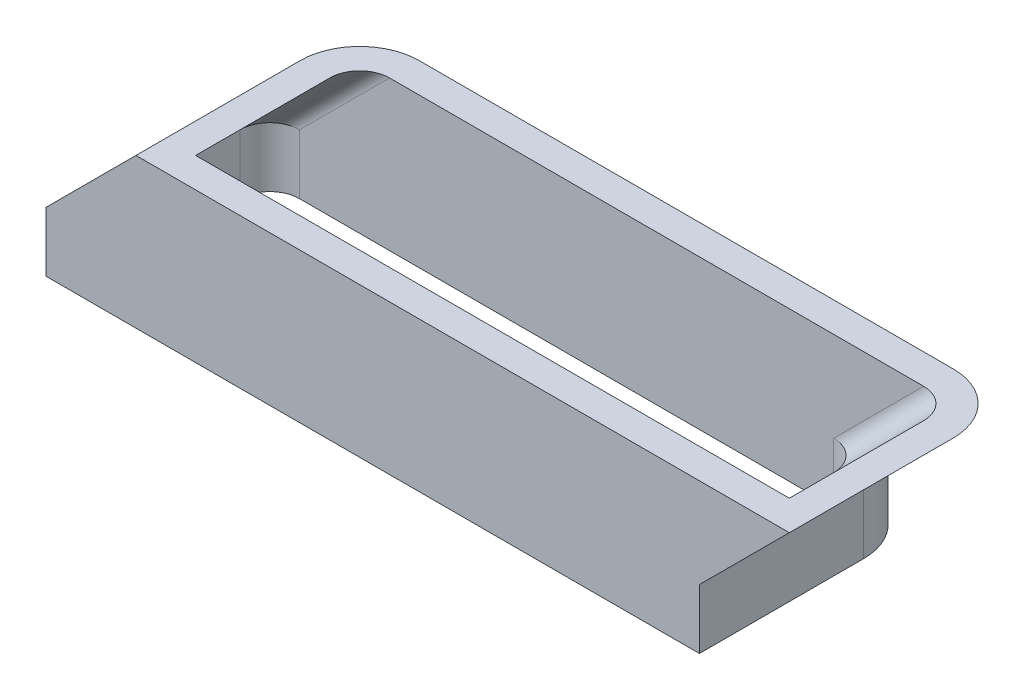
ISO-10303-21;
HEADER;
FILE_DESCRIPTION(('STEP AP214'),'2;1');
FILE_NAME('part.step','',(''),(''),'','','');
FILE_SCHEMA(('AUTOMOTIVE_DESIGN { 1 0 10303 214 1 1 1 1 }'));
ENDSEC;
DATA;
#1=APPLICATION_CONTEXT('core data for automotive mechanical design processes');
#2=APPLICATION_PROTOCOL_DEFINITION('international standard','automotive_design',2000,#1);
#3=PRODUCT_CONTEXT('',#1,'mechanical');
#4=PRODUCT('Part','Part','',(#3));
#5=PRODUCT_RELATED_PRODUCT_CATEGORY('part','',(#4));
#6=PRODUCT_DEFINITION_FORMATION('','',#4);
#7=PRODUCT_DEFINITION_CONTEXT('part definition',#1,'design');
#8=PRODUCT_DEFINITION('design','',#6,#7);
#9=PRODUCT_DEFINITION_SHAPE('','',#8);
#10=(LENGTH_UNIT() NAMED_UNIT(*) SI_UNIT(.MILLI.,.METRE.));
#11=(NAMED_UNIT(*) PLANE_ANGLE_UNIT() SI_UNIT($,.RADIAN.));
#12=(NAMED_UNIT(*) SI_UNIT($,.STERADIAN.) SOLID_ANGLE_UNIT());
#13=UNCERTAINTY_MEASURE_WITH_UNIT(LENGTH_MEASURE(1.E-05),#10,'distance_accuracy_value','');
#14=(GEOMETRIC_REPRESENTATION_CONTEXT(3) GLOBAL_UNCERTAINTY_ASSIGNED_CONTEXT((#13)) GLOBAL_UNIT_ASSIGNED_CONTEXT((#10,
#11,#12)) REPRESENTATION_CONTEXT('',''));
#15=CARTESIAN_POINT('',(0.,0.,0.));
#16=DIRECTION('',(0.,0.,1.));
#17=DIRECTION('',(1.,0.,0.));
#18=AXIS2_PLACEMENT_3D('',#15,#16,#17);
#19=CARTESIAN_POINT('',(-13.4207630136694,0.,5.29034482758621));
#20=DIRECTION('',(0.,0.,1.));
#21=DIRECTION('',(1.,0.,0.));
#22=AXIS2_PLACEMENT_3D('',#19,#20,#21);
#23=PLANE('',#22);
#24=DIRECTION('',(0.707106781186546,0.707106781186549,0.));
#25=VECTOR('',#24,1.);
#26=CARTESIAN_POINT('',(8.47923698633057,0.,5.29034482758621));
#27=LINE('',#26,#25);
#28=CARTESIAN_POINT('',(8.47923698633058,0.,5.29034482758621));
#29=VERTEX_POINT('',#28);
#30=CARTESIAN_POINT('',(11.4929724598586,3.01373547352806,5.29034482758621));
#31=VERTEX_POINT('',#30);
#32=EDGE_CURVE('E183',#29,#31,#27,.T.);
#33=ORIENTED_EDGE('',*,*,#32,.T.);
#34=DIRECTION('',(1.,0.,0.));
#35=VECTOR('',#34,1.);
#36=CARTESIAN_POINT('',(-10.4070275401414,3.01373547352806,5.29034482758621));
#37=LINE('',#36,#35);
#38=CARTESIAN_POINT('',(-10.4070275401414,3.01373547352806,5.29034482758621));
#39=VERTEX_POINT('',#38);
#40=EDGE_CURVE('E155',#39,#31,#37,.T.);
#41=ORIENTED_EDGE('',*,*,#40,.F.);
#42=DIRECTION('',(0.707106781186546,0.707106781186549,0.));
#43=VECTOR('',#42,1.);
#44=CARTESIAN_POINT('',(-13.4207630136694,0.,5.29034482758621));
#45=LINE('',#44,#43);
#46=CARTESIAN_POINT('',(-13.4207630136694,0.,5.29034482758621));
#47=VERTEX_POINT('',#46);
#48=EDGE_CURVE('E187',#47,#39,#45,.T.);
#49=ORIENTED_EDGE('',*,*,#48,.F.);
#50=DIRECTION('',(0.,1.,0.));
#51=VECTOR('',#50,1.);
#52=CARTESIAN_POINT('',(-13.4207630136694,-2.,5.2903448275862));
#53=LINE('',#52,#51);
#54=CARTESIAN_POINT('',(-13.4207630136694,-2.,5.2903448275862));
#55=VERTEX_POINT('',#54);
#56=EDGE_CURVE('E242',#55,#47,#53,.T.);
#57=ORIENTED_EDGE('',*,*,#56,.F.);
#58=DIRECTION('',(-1.,0.,0.));
#59=VECTOR('',#58,1.);
#60=CARTESIAN_POINT('',(8.47923698633058,-2.,5.29034482758621));
#61=LINE('',#60,#59);
#62=CARTESIAN_POINT('',(8.47923698633058,-2.,5.29034482758621));
#63=VERTEX_POINT('',#62);
#64=EDGE_CURVE('E241',#63,#55,#61,.T.);
#65=ORIENTED_EDGE('',*,*,#64,.F.);
#66=DIRECTION('',(0.,1.,0.));
#67=VECTOR('',#66,1.);
#68=CARTESIAN_POINT('',(8.47923698633058,-2.,5.29034482758621));
#69=LINE('',#68,#67);
#70=EDGE_CURVE('E235',#63,#29,#69,.T.);
#71=ORIENTED_EDGE('',*,*,#70,.T.);
#72=EDGE_LOOP('',(#33,#41,#49,#57,#65,#71));
#73=FACE_BOUND('',#72,.T.);
#74=ADVANCED_FACE('F45',(#73),#23,.T.);
#75=CARTESIAN_POINT('',(8.47923698633058,0.,-0.209655172413795));
#76=DIRECTION('',(0.707106781186549,-0.707106781186546,0.));
#77=DIRECTION('',(0.707106781186546,0.707106781186549,0.));
#78=AXIS2_PLACEMENT_3D('',#75,#76,#77);
#79=PLANE('',#78);
#80=DIRECTION('',(0.707106781186546,0.707106781186549,0.));
#81=VECTOR('',#80,1.);
#82=CARTESIAN_POINT('',(8.47923698633057,0.,-0.209655172413795));
#83=LINE('',#82,#81);
#84=CARTESIAN_POINT('',(8.47923698633058,0.,-0.209655172413795));
#85=VERTEX_POINT('',#84);
#86=CARTESIAN_POINT('',(11.4929724598586,3.01373547352806,-0.209655172413795));
#87=VERTEX_POINT('',#86);
#88=EDGE_CURVE('E186',#85,#87,#83,.T.);
#89=ORIENTED_EDGE('',*,*,#88,.T.);
#90=DIRECTION('',(0.,0.,-1.));
#91=VECTOR('',#90,1.);
#92=CARTESIAN_POINT('',(11.4929724598586,3.01373547352806,-0.209655172413795));
#93=LINE('',#92,#91);
#94=EDGE_CURVE('E158',#31,#87,#93,.T.);
#95=ORIENTED_EDGE('',*,*,#94,.F.);
#96=ORIENTED_EDGE('',*,*,#32,.F.);
#97=DIRECTION('',(0.,0.,-1.));
#98=VECTOR('',#97,1.);
#99=CARTESIAN_POINT('',(8.47923698633058,0.,-0.209655172413795));
#100=LINE('',#99,#98);
#101=EDGE_CURVE('E175',#29,#85,#100,.T.);
#102=ORIENTED_EDGE('',*,*,#101,.T.);
#103=EDGE_LOOP('',(#89,#95,#96,#102));
#104=FACE_BOUND('',#103,.T.);
#105=ADVANCED_FACE('F228',(#104),#79,.T.);
#106=CARTESIAN_POINT('',(8.47923698633057,0.,-0.209655172413794));
#107=CARTESIAN_POINT('',(11.4929724598586,3.01373547352806,-0.209655172413794));
#108=CARTESIAN_POINT('',(8.47923698633057,0.,-1.38122804766761));
#109=CARTESIAN_POINT('',(11.4929724598586,3.01373547352806,-1.38122804766761));
#110=CARTESIAN_POINT('',(7.65080986158438,0.,-2.2096551724138));
#111=CARTESIAN_POINT('',(10.6645453351124,3.01373547352806,-2.2096551724138));
#112=CARTESIAN_POINT('',(6.47923698633057,0.,-2.2096551724138));
#113=CARTESIAN_POINT('',(9.49297245985863,3.01373547352806,-2.2096551724138));
#114=(BOUNDED_SURFACE() B_SPLINE_SURFACE(3,1,((#106,#107),(#108,#109),(#110,#111),(#112,#113)),
.UNSPECIFIED.,.F.,.F.,.F.) B_SPLINE_SURFACE_WITH_KNOTS((4,4),(2,2),(0.,1.),(0.,1.),
.UNSPECIFIED.) GEOMETRIC_REPRESENTATION_ITEM() RATIONAL_B_SPLINE_SURFACE(((1.,1.),
(0.804737854124365,0.804737854124365),(0.804737854124365,0.804737854124365),(1.,1.))) REPRESENTATION_ITEM('') SURFACE());
#115=DIRECTION('',(0.707106781186546,0.707106781186549,0.));
#116=VECTOR('',#115,1.);
#117=CARTESIAN_POINT('',(6.47923698633057,0.,-2.20965517241379));
#118=LINE('',#117,#116);
#119=CARTESIAN_POINT('',(6.47923698633057,0.,-2.20965517241379));
#120=VERTEX_POINT('',#119);
#121=CARTESIAN_POINT('',(9.49297245985863,3.01373547352806,-2.20965517241379));
#122=VERTEX_POINT('',#121);
#123=EDGE_CURVE('E192',#120,#122,#118,.T.);
#124=CARTESIAN_POINT('',(9.49297245985863,3.01373547352806,-0.209655172413795));
#125=DIRECTION('',(0.,1.,0.));
#126=DIRECTION('',(0.,0.,-1.));
#127=AXIS2_PLACEMENT_3D('',#124,#125,#126);
#128=CIRCLE('',#127,2.);
#129=EDGE_CURVE('E167',#87,#122,#128,.T.);
#130=CARTESIAN_POINT('',(6.47923698633057,0.,-0.209655172413795));
#131=DIRECTION('',(0.,1.,0.));
#132=DIRECTION('',(0.,0.,-1.));
#133=AXIS2_PLACEMENT_3D('',#130,#131,#132);
#134=CIRCLE('',#133,2.);
#135=EDGE_CURVE('E163',#85,#120,#134,.T.);
#136=ORIENTED_EDGE('',*,*,#123,.T.);
#137=ORIENTED_EDGE('',*,*,#129,.F.);
#138=ORIENTED_EDGE('',*,*,#88,.F.);
#139=ORIENTED_EDGE('',*,*,#135,.T.);
#140=EDGE_LOOP('',(#136,#137,#138,#139));
#141=FACE_BOUND('',#140,.T.);
#142=ADVANCED_FACE('F208',(#141),#114,.T.);
#143=CARTESIAN_POINT('',(-11.4207630136694,0.,-2.20965517241379));
#144=DIRECTION('',(0.,0.,-1.));
#145=DIRECTION('',(-1.,0.,0.));
#146=AXIS2_PLACEMENT_3D('',#143,#144,#145);
#147=PLANE('',#146);
#148=DIRECTION('',(0.707106781186546,0.707106781186549,0.));
#149=VECTOR('',#148,1.);
#150=CARTESIAN_POINT('',(-11.4207630136694,0.,-2.20965517241379));
#151=LINE('',#150,#149);
#152=CARTESIAN_POINT('',(-11.4207630136694,0.,-2.20965517241379));
#153=VERTEX_POINT('',#152);
#154=CARTESIAN_POINT('',(-8.40702754014137,3.01373547352806,-2.20965517241379));
#155=VERTEX_POINT('',#154);
#156=EDGE_CURVE('E194',#153,#155,#151,.T.);
#157=ORIENTED_EDGE('',*,*,#156,.T.);
#158=DIRECTION('',(-1.,0.,0.));
#159=VECTOR('',#158,1.);
#160=CARTESIAN_POINT('',(-8.40702754014137,3.01373547352806,-2.20965517241379));
#161=LINE('',#160,#159);
#162=EDGE_CURVE('E164',#122,#155,#161,.T.);
#163=ORIENTED_EDGE('',*,*,#162,.F.);
#164=ORIENTED_EDGE('',*,*,#123,.F.);
#165=DIRECTION('',(0.,1.,0.));
#166=VECTOR('',#165,1.);
#167=CARTESIAN_POINT('',(6.47923698633057,-2.,-2.20965517241379));
#168=LINE('',#167,#166);
#169=CARTESIAN_POINT('',(6.47923698633057,-2.,-2.20965517241379));
#170=VERTEX_POINT('',#169);
#171=EDGE_CURVE('E221',#170,#120,#168,.T.);
#172=ORIENTED_EDGE('',*,*,#171,.F.);
#173=DIRECTION('',(1.,0.,0.));
#174=VECTOR('',#173,1.);
#175=CARTESIAN_POINT('',(-11.4207630136694,-2.,-2.20965517241379));
#176=LINE('',#175,#174);
#177=CARTESIAN_POINT('',(-11.4207630136694,-2.,-2.20965517241379));
#178=VERTEX_POINT('',#177);
#179=EDGE_CURVE('E556',#178,#170,#176,.T.);
#180=ORIENTED_EDGE('',*,*,#179,.F.);
#181=DIRECTION('',(0.,1.,0.));
#182=VECTOR('',#181,1.);
#183=CARTESIAN_POINT('',(-11.4207630136694,-2.,-2.20965517241379));
#184=LINE('',#183,#182);
#185=EDGE_CURVE('E559',#178,#153,#184,.T.);
#186=ORIENTED_EDGE('',*,*,#185,.T.);
#187=EDGE_LOOP('',(#157,#163,#164,#172,#180,#186));
#188=FACE_BOUND('',#187,.T.);
#189=ADVANCED_FACE('F204',(#188),#147,.T.);
#190=CARTESIAN_POINT('',(-11.4207630136694,0.,-2.20965517241379));
#191=CARTESIAN_POINT('',(-8.40702754014137,3.01373547352806,-2.20965517241379));
#192=CARTESIAN_POINT('',(-12.5923358889232,0.,-2.20965517241379));
#193=CARTESIAN_POINT('',(-9.57860041539518,3.01373547352806,-2.20965517241379));
#194=CARTESIAN_POINT('',(-13.4207630136694,0.,-1.3812280476676));
#195=CARTESIAN_POINT('',(-10.4070275401414,3.01373547352806,-1.3812280476676));
#196=CARTESIAN_POINT('',(-13.4207630136694,0.,-0.209655172413784));
#197=CARTESIAN_POINT('',(-10.4070275401414,3.01373547352806,-0.209655172413784));
#198=(BOUNDED_SURFACE() B_SPLINE_SURFACE(3,1,((#190,#191),(#192,#193),(#194,#195),(#196,#197)),
.UNSPECIFIED.,.F.,.F.,.F.) B_SPLINE_SURFACE_WITH_KNOTS((4,4),(2,2),(0.,1.),(0.,1.),
.UNSPECIFIED.) GEOMETRIC_REPRESENTATION_ITEM() RATIONAL_B_SPLINE_SURFACE(((1.,1.),
(0.804737854124364,0.804737854124364),(0.804737854124364,0.804737854124364),(1.,1.))) REPRESENTATION_ITEM('') SURFACE());
#199=DIRECTION('',(0.707106781186546,0.707106781186549,0.));
#200=VECTOR('',#199,1.);
#201=CARTESIAN_POINT('',(-13.4207630136694,0.,-0.209655172413784));
#202=LINE('',#201,#200);
#203=CARTESIAN_POINT('',(-13.4207630136694,0.,-0.209655172413784));
#204=VERTEX_POINT('',#203);
#205=CARTESIAN_POINT('',(-10.4070275401414,3.01373547352806,-0.209655172413784));
#206=VERTEX_POINT('',#205);
#207=EDGE_CURVE('E49',#204,#206,#202,.T.);
#208=CARTESIAN_POINT('',(-8.40702754014137,3.01373547352806,-0.209655172413795));
#209=DIRECTION('',(0.,1.,0.));
#210=DIRECTION('',(0.,0.,1.));
#211=AXIS2_PLACEMENT_3D('',#208,#209,#210);
#212=CIRCLE('',#211,2.);
#213=EDGE_CURVE('E160',#155,#206,#212,.T.);
#214=CARTESIAN_POINT('',(-11.4207630136694,0.,-0.209655172413795));
#215=DIRECTION('',(0.,1.,0.));
#216=DIRECTION('',(0.,0.,1.));
#217=AXIS2_PLACEMENT_3D('',#214,#215,#216);
#218=CIRCLE('',#217,2.);
#219=EDGE_CURVE('E176',#153,#204,#218,.T.);
#220=ORIENTED_EDGE('',*,*,#207,.T.);
#221=ORIENTED_EDGE('',*,*,#213,.F.);
#222=ORIENTED_EDGE('',*,*,#156,.F.);
#223=ORIENTED_EDGE('',*,*,#219,.T.);
#224=EDGE_LOOP('',(#220,#221,#222,#223));
#225=FACE_BOUND('',#224,.T.);
#226=ADVANCED_FACE('F200',(#225),#198,.T.);
#227=CARTESIAN_POINT('',(-13.4207630136694,0.,-0.209655172413784));
#228=DIRECTION('',(-0.707106781186549,0.707106781186546,0.));
#229=DIRECTION('',(-0.707106781186546,-0.707106781186549,0.));
#230=AXIS2_PLACEMENT_3D('',#227,#228,#229);
#231=PLANE('',#230);
#232=DIRECTION('',(0.,0.,1.));
#233=VECTOR('',#232,1.);
#234=CARTESIAN_POINT('',(-10.4070275401414,3.01373547352806,-0.209655172413784));
#235=LINE('',#234,#233);
#236=EDGE_CURVE('E90',#206,#39,#235,.T.);
#237=ORIENTED_EDGE('',*,*,#236,.F.);
#238=ORIENTED_EDGE('',*,*,#207,.F.);
#239=DIRECTION('',(0.,0.,1.));
#240=VECTOR('',#239,1.);
#241=CARTESIAN_POINT('',(-13.4207630136694,0.,-0.209655172413784));
#242=LINE('',#241,#240);
#243=EDGE_CURVE('E172',#204,#47,#242,.T.);
#244=ORIENTED_EDGE('',*,*,#243,.T.);
#245=ORIENTED_EDGE('',*,*,#48,.T.);
#246=EDGE_LOOP('',(#237,#238,#244,#245));
#247=FACE_BOUND('',#246,.T.);
#248=ADVANCED_FACE('F47',(#247),#231,.T.);
#249=CARTESIAN_POINT('',(-8.40702754014137,3.01373547352806,-0.209655172413795));
#250=DIRECTION('',(0.,1.,0.));
#251=DIRECTION('',(0.,0.,1.));
#252=AXIS2_PLACEMENT_3D('',#249,#250,#251);
#253=PLANE('',#252);
#254=DIRECTION('',(0.,0.,-1.));
#255=VECTOR('',#254,1.);
#256=CARTESIAN_POINT('',(10.4929724598586,3.01373547352806,-0.209655172413795));
#257=LINE('',#256,#255);
#258=CARTESIAN_POINT('',(10.4929724598586,3.01373547352806,-0.209655172413795));
#259=VERTEX_POINT('',#258);
#260=CARTESIAN_POINT('',(10.4929724598586,3.01373547352806,4.29034482758621));
#261=VERTEX_POINT('',#260);
#262=EDGE_CURVE('E11',#259,#261,#257,.F.);
#263=ORIENTED_EDGE('',*,*,#262,.T.);
#264=DIRECTION('',(1.,0.,0.));
#265=VECTOR('',#264,1.);
#266=CARTESIAN_POINT('',(-9.40702754014137,3.01373547352806,4.29034482758621));
#267=LINE('',#266,#265);
#268=CARTESIAN_POINT('',(-9.40702754014137,3.01373547352806,4.29034482758621));
#269=VERTEX_POINT('',#268);
#270=EDGE_CURVE('E250',#261,#269,#267,.F.);
#271=ORIENTED_EDGE('',*,*,#270,.T.);
#272=DIRECTION('',(0.,0.,1.));
#273=VECTOR('',#272,1.);
#274=CARTESIAN_POINT('',(-9.40702754014137,3.01373547352806,-0.209655172413784));
#275=LINE('',#274,#273);
#276=CARTESIAN_POINT('',(-9.40702754014137,3.01373547352806,-0.209655172413784));
#277=VERTEX_POINT('',#276);
#278=EDGE_CURVE('E119',#269,#277,#275,.F.);
#279=ORIENTED_EDGE('',*,*,#278,.T.);
#280=CARTESIAN_POINT('',(-8.40702754014137,3.01373547352806,-0.209655172413795));
#281=DIRECTION('',(0.,1.,0.));
#282=DIRECTION('',(0.,0.,1.));
#283=AXIS2_PLACEMENT_3D('',#280,#281,#282);
#284=CIRCLE('',#283,1.);
#285=CARTESIAN_POINT('',(-8.40702754014137,3.01373547352806,-1.20965517241379));
#286=VERTEX_POINT('',#285);
#287=EDGE_CURVE('E113',#277,#286,#284,.F.);
#288=ORIENTED_EDGE('',*,*,#287,.T.);
#289=DIRECTION('',(-1.,0.,0.));
#290=VECTOR('',#289,1.);
#291=CARTESIAN_POINT('',(-8.40702754014137,3.01373547352806,-1.20965517241379));
#292=LINE('',#291,#290);
#293=CARTESIAN_POINT('',(9.49297245985863,3.01373547352806,-1.20965517241379));
#294=VERTEX_POINT('',#293);
#295=EDGE_CURVE('E117',#286,#294,#292,.F.);
#296=ORIENTED_EDGE('',*,*,#295,.T.);
#297=CARTESIAN_POINT('',(9.49297245985863,3.01373547352806,-0.209655172413795));
#298=DIRECTION('',(0.,1.,0.));
#299=DIRECTION('',(0.,0.,-1.));
#300=AXIS2_PLACEMENT_3D('',#297,#298,#299);
#301=CIRCLE('',#300,1.);
#302=EDGE_CURVE('E63',#294,#259,#301,.F.);
#303=ORIENTED_EDGE('',*,*,#302,.T.);
#304=EDGE_LOOP('',(#263,#271,#279,#288,#296,#303));
#305=FACE_BOUND('',#304,.T.);
#306=ORIENTED_EDGE('',*,*,#213,.T.);
#307=ORIENTED_EDGE('',*,*,#236,.T.);
#308=ORIENTED_EDGE('',*,*,#40,.T.);
#309=ORIENTED_EDGE('',*,*,#94,.T.);
#310=ORIENTED_EDGE('',*,*,#129,.T.);
#311=ORIENTED_EDGE('',*,*,#162,.T.);
#312=EDGE_LOOP('',(#306,#307,#308,#309,#310,#311));
#313=FACE_BOUND('',#312,.T.);
#314=ADVANCED_FACE('F115',(#305,#313),#253,.T.);
#315=CARTESIAN_POINT('',(-12.4207630136694,0.,4.29034482758621));
#316=DIRECTION('',(0.,0.,-1.));
#317=DIRECTION('',(-1.,0.,0.));
#318=AXIS2_PLACEMENT_3D('',#315,#316,#317);
#319=PLANE('',#318);
#320=DIRECTION('',(0.707106781186546,0.707106781186549,0.));
#321=VECTOR('',#320,1.);
#322=CARTESIAN_POINT('',(-12.4207630136694,0.,4.29034482758621));
#323=LINE('',#322,#321);
#324=CARTESIAN_POINT('',(-12.4207630136694,0.,4.29034482758621));
#325=VERTEX_POINT('',#324);
#326=EDGE_CURVE('E252',#325,#269,#323,.T.);
#327=ORIENTED_EDGE('',*,*,#326,.T.);
#328=ORIENTED_EDGE('',*,*,#270,.F.);
#329=DIRECTION('',(0.707106781186546,0.707106781186549,0.));
#330=VECTOR('',#329,1.);
#331=CARTESIAN_POINT('',(7.47923698633057,0.,4.29034482758621));
#332=LINE('',#331,#330);
#333=CARTESIAN_POINT('',(7.47923698633057,0.,4.29034482758621));
#334=VERTEX_POINT('',#333);
#335=EDGE_CURVE('E153',#334,#261,#332,.T.);
#336=ORIENTED_EDGE('',*,*,#335,.F.);
#337=DIRECTION('',(0.,1.,0.));
#338=VECTOR('',#337,1.);
#339=CARTESIAN_POINT('',(7.47923698633057,-2.,4.29034482758621));
#340=LINE('',#339,#338);
#341=CARTESIAN_POINT('',(7.47923698633057,-2.,4.29034482758621));
#342=VERTEX_POINT('',#341);
#343=EDGE_CURVE('E543',#342,#334,#340,.T.);
#344=ORIENTED_EDGE('',*,*,#343,.F.);
#345=DIRECTION('',(-1.,0.,0.));
#346=VECTOR('',#345,1.);
#347=CARTESIAN_POINT('',(7.47923698633057,-2.,4.29034482758621));
#348=LINE('',#347,#346);
#349=CARTESIAN_POINT('',(-12.4207630136694,-2.,4.29034482758621));
#350=VERTEX_POINT('',#349);
#351=EDGE_CURVE('E574',#342,#350,#348,.T.);
#352=ORIENTED_EDGE('',*,*,#351,.T.);
#353=DIRECTION('',(0.,1.,0.));
#354=VECTOR('',#353,1.);
#355=CARTESIAN_POINT('',(-12.4207630136694,-2.,4.29034482758621));
#356=LINE('',#355,#354);
#357=EDGE_CURVE('E536',#350,#325,#356,.T.);
#358=ORIENTED_EDGE('',*,*,#357,.T.);
#359=EDGE_LOOP('',(#327,#328,#336,#344,#352,#358));
#360=FACE_BOUND('',#359,.T.);
#361=ADVANCED_FACE('F313',(#360),#319,.T.);
#362=CARTESIAN_POINT('',(-12.4207630136694,0.,-0.209655172413784));
#363=DIRECTION('',(0.707106781186549,-0.707106781186546,0.));
#364=DIRECTION('',(0.707106781186546,0.707106781186549,0.));
#365=AXIS2_PLACEMENT_3D('',#362,#363,#364);
#366=PLANE('',#365);
#367=DIRECTION('',(0.707106781186546,0.707106781186549,0.));
#368=VECTOR('',#367,1.);
#369=CARTESIAN_POINT('',(-12.4207630136694,0.,-0.209655172413784));
#370=LINE('',#369,#368);
#371=CARTESIAN_POINT('',(-12.4207630136694,0.,-0.209655172413784));
#372=VERTEX_POINT('',#371);
#373=EDGE_CURVE('E125',#372,#277,#370,.T.);
#374=ORIENTED_EDGE('',*,*,#373,.T.);
#375=ORIENTED_EDGE('',*,*,#278,.F.);
#376=ORIENTED_EDGE('',*,*,#326,.F.);
#377=DIRECTION('',(0.,0.,1.));
#378=VECTOR('',#377,1.);
#379=CARTESIAN_POINT('',(-12.4207630136694,0.,-0.209655172413784));
#380=LINE('',#379,#378);
#381=EDGE_CURVE('E99',#325,#372,#380,.F.);
#382=ORIENTED_EDGE('',*,*,#381,.T.);
#383=EDGE_LOOP('',(#374,#375,#376,#382));
#384=FACE_BOUND('',#383,.T.);
#385=ADVANCED_FACE('F260',(#384),#366,.T.);
#386=CARTESIAN_POINT('',(-12.4207630136694,0.,-0.209655172413784));
#387=CARTESIAN_POINT('',(-9.40702754014137,3.01373547352806,-0.209655172413784));
#388=CARTESIAN_POINT('',(-12.4207630136694,0.,-0.795441610040694));
#389=CARTESIAN_POINT('',(-9.40702754014138,3.01373547352806,-0.795441610040694));
#390=CARTESIAN_POINT('',(-12.0065494512963,0.,-1.20965517241379));
#391=CARTESIAN_POINT('',(-8.99281397776828,3.01373547352806,-1.20965517241379));
#392=CARTESIAN_POINT('',(-11.4207630136694,0.,-1.20965517241379));
#393=CARTESIAN_POINT('',(-8.40702754014137,3.01373547352806,-1.20965517241379));
#394=(BOUNDED_SURFACE() B_SPLINE_SURFACE(3,1,((#386,#387),(#388,#389),(#390,#391),(#392,#393)),
.UNSPECIFIED.,.F.,.F.,.F.) B_SPLINE_SURFACE_WITH_KNOTS((4,4),(2,2),(0.,1.),(0.,1.),
.UNSPECIFIED.) GEOMETRIC_REPRESENTATION_ITEM() RATIONAL_B_SPLINE_SURFACE(((1.,1.),
(0.804737854124363,0.804737854124363),(0.804737854124363,0.804737854124363),(1.,1.))) REPRESENTATION_ITEM('') SURFACE());
#395=DIRECTION('',(0.707106781186546,0.707106781186549,0.));
#396=VECTOR('',#395,1.);
#397=CARTESIAN_POINT('',(-11.4207630136694,0.,-1.20965517241379));
#398=LINE('',#397,#396);
#399=CARTESIAN_POINT('',(-11.4207630136694,0.,-1.20965517241379));
#400=VERTEX_POINT('',#399);
#401=EDGE_CURVE('E124',#400,#286,#398,.T.);
#402=CARTESIAN_POINT('',(-11.4207630136694,0.,-0.209655172413795));
#403=DIRECTION('',(0.,1.,0.));
#404=DIRECTION('',(0.,0.,1.));
#405=AXIS2_PLACEMENT_3D('',#402,#403,#404);
#406=CIRCLE('',#405,1.);
#407=EDGE_CURVE('E140',#372,#400,#406,.F.);
#408=ORIENTED_EDGE('',*,*,#401,.T.);
#409=ORIENTED_EDGE('',*,*,#287,.F.);
#410=ORIENTED_EDGE('',*,*,#373,.F.);
#411=ORIENTED_EDGE('',*,*,#407,.T.);
#412=EDGE_LOOP('',(#408,#409,#410,#411));
#413=FACE_BOUND('',#412,.T.);
#414=ADVANCED_FACE('F138',(#413),#394,.T.);
#415=CARTESIAN_POINT('',(-11.4207630136694,0.,-1.20965517241379));
#416=DIRECTION('',(0.,0.,1.));
#417=DIRECTION('',(1.,0.,0.));
#418=AXIS2_PLACEMENT_3D('',#415,#416,#417);
#419=PLANE('',#418);
#420=DIRECTION('',(0.707106781186546,0.707106781186549,0.));
#421=VECTOR('',#420,1.);
#422=CARTESIAN_POINT('',(6.47923698633057,0.,-1.20965517241379));
#423=LINE('',#422,#421);
#424=CARTESIAN_POINT('',(6.47923698633057,0.,-1.20965517241379));
#425=VERTEX_POINT('',#424);
#426=EDGE_CURVE('E135',#425,#294,#423,.T.);
#427=ORIENTED_EDGE('',*,*,#426,.T.);
#428=ORIENTED_EDGE('',*,*,#295,.F.);
#429=ORIENTED_EDGE('',*,*,#401,.F.);
#430=DIRECTION('',(0.,1.,0.));
#431=VECTOR('',#430,1.);
#432=CARTESIAN_POINT('',(-11.4207630136694,-2.,-1.20965517241379));
#433=LINE('',#432,#431);
#434=CARTESIAN_POINT('',(-11.4207630136694,-2.,-1.20965517241379));
#435=VERTEX_POINT('',#434);
#436=EDGE_CURVE('E298',#435,#400,#433,.T.);
#437=ORIENTED_EDGE('',*,*,#436,.F.);
#438=DIRECTION('',(1.,0.,0.));
#439=VECTOR('',#438,1.);
#440=CARTESIAN_POINT('',(-11.4207630136694,-2.,-1.20965517241379));
#441=LINE('',#440,#439);
#442=CARTESIAN_POINT('',(6.47923698633057,-2.,-1.20965517241379));
#443=VERTEX_POINT('',#442);
#444=EDGE_CURVE('E538',#435,#443,#441,.T.);
#445=ORIENTED_EDGE('',*,*,#444,.T.);
#446=DIRECTION('',(0.,1.,0.));
#447=VECTOR('',#446,1.);
#448=CARTESIAN_POINT('',(6.47923698633057,-2.,-1.20965517241379));
#449=LINE('',#448,#447);
#450=EDGE_CURVE('E534',#443,#425,#449,.T.);
#451=ORIENTED_EDGE('',*,*,#450,.T.);
#452=EDGE_LOOP('',(#427,#428,#429,#437,#445,#451));
#453=FACE_BOUND('',#452,.T.);
#454=ADVANCED_FACE('F130',(#453),#419,.T.);
#455=CARTESIAN_POINT('',(6.47923698633057,0.,-1.2096551724138));
#456=CARTESIAN_POINT('',(9.49297245985863,3.01373547352806,-1.2096551724138));
#457=CARTESIAN_POINT('',(7.06502342395748,0.,-1.2096551724138));
#458=CARTESIAN_POINT('',(10.0787588974855,3.01373547352806,-1.2096551724138));
#459=CARTESIAN_POINT('',(7.47923698633057,0.,-0.795441610040701));
#460=CARTESIAN_POINT('',(10.4929724598586,3.01373547352806,-0.795441610040701));
#461=CARTESIAN_POINT('',(7.47923698633057,0.,-0.209655172413794));
#462=CARTESIAN_POINT('',(10.4929724598586,3.01373547352806,-0.209655172413794));
#463=(BOUNDED_SURFACE() B_SPLINE_SURFACE(3,1,((#455,#456),(#457,#458),(#459,#460),(#461,#462)),
.UNSPECIFIED.,.F.,.F.,.F.) B_SPLINE_SURFACE_WITH_KNOTS((4,4),(2,2),(0.,1.),(0.,1.),
.UNSPECIFIED.) GEOMETRIC_REPRESENTATION_ITEM() RATIONAL_B_SPLINE_SURFACE(((1.,1.),
(0.804737854124365,0.804737854124365),(0.804737854124365,0.804737854124365),(1.,1.))) REPRESENTATION_ITEM('') SURFACE());
#464=DIRECTION('',(0.707106781186546,0.707106781186549,0.));
#465=VECTOR('',#464,1.);
#466=CARTESIAN_POINT('',(7.47923698633057,0.,-0.209655172413795));
#467=LINE('',#466,#465);
#468=CARTESIAN_POINT('',(7.47923698633058,0.,-0.209655172413795));
#469=VERTEX_POINT('',#468);
#470=EDGE_CURVE('E55',#469,#259,#467,.T.);
#471=CARTESIAN_POINT('',(6.47923698633057,0.,-0.209655172413795));
#472=DIRECTION('',(0.,1.,0.));
#473=DIRECTION('',(0.,0.,-1.));
#474=AXIS2_PLACEMENT_3D('',#471,#472,#473);
#475=CIRCLE('',#474,1.);
#476=EDGE_CURVE('E145',#425,#469,#475,.F.);
#477=ORIENTED_EDGE('',*,*,#470,.T.);
#478=ORIENTED_EDGE('',*,*,#302,.F.);
#479=ORIENTED_EDGE('',*,*,#426,.F.);
#480=ORIENTED_EDGE('',*,*,#476,.T.);
#481=EDGE_LOOP('',(#477,#478,#479,#480));
#482=FACE_BOUND('',#481,.T.);
#483=ADVANCED_FACE('F318',(#482),#463,.T.);
#484=CARTESIAN_POINT('',(7.47923698633058,0.,-0.209655172413795));
#485=DIRECTION('',(-0.707106781186549,0.707106781186546,0.));
#486=DIRECTION('',(-0.707106781186546,-0.707106781186549,0.));
#487=AXIS2_PLACEMENT_3D('',#484,#485,#486);
#488=PLANE('',#487);
#489=ORIENTED_EDGE('',*,*,#262,.F.);
#490=ORIENTED_EDGE('',*,*,#470,.F.);
#491=DIRECTION('',(0.,0.,-1.));
#492=VECTOR('',#491,1.);
#493=CARTESIAN_POINT('',(7.47923698633058,0.,-0.209655172413795));
#494=LINE('',#493,#492);
#495=EDGE_CURVE('E148',#469,#334,#494,.F.);
#496=ORIENTED_EDGE('',*,*,#495,.T.);
#497=ORIENTED_EDGE('',*,*,#335,.T.);
#498=EDGE_LOOP('',(#489,#490,#496,#497));
#499=FACE_BOUND('',#498,.T.);
#500=ADVANCED_FACE('F315',(#499),#488,.T.);
#501=CARTESIAN_POINT('',(6.47923698633057,-2.,-0.209655172413795));
#502=DIRECTION('',(0.,-1.,0.));
#503=DIRECTION('',(0.,0.,-1.));
#504=AXIS2_PLACEMENT_3D('',#501,#502,#503);
#505=PLANE('',#504);
#506=CARTESIAN_POINT('',(6.47923698633057,-2.,-0.209655172413795));
#507=DIRECTION('',(0.,-1.,0.));
#508=DIRECTION('',(0.,0.,-1.));
#509=AXIS2_PLACEMENT_3D('',#506,#507,#508);
#510=CIRCLE('',#509,2.);
#511=CARTESIAN_POINT('',(8.47923698633058,-2.,-0.209655172413795));
#512=VERTEX_POINT('',#511);
#513=EDGE_CURVE('E547',#170,#512,#510,.T.);
#514=ORIENTED_EDGE('',*,*,#513,.T.);
#515=DIRECTION('',(0.,0.,1.));
#516=VECTOR('',#515,1.);
#517=CARTESIAN_POINT('',(8.47923698633058,-2.,-0.209655172413795));
#518=LINE('',#517,#516);
#519=EDGE_CURVE('E550',#512,#63,#518,.T.);
#520=ORIENTED_EDGE('',*,*,#519,.T.);
#521=ORIENTED_EDGE('',*,*,#64,.T.);
#522=DIRECTION('',(0.,0.,-1.));
#523=VECTOR('',#522,1.);
#524=CARTESIAN_POINT('',(-13.4207630136694,-2.,5.2903448275862));
#525=LINE('',#524,#523);
#526=CARTESIAN_POINT('',(-13.4207630136694,-2.,-0.209655172413784));
#527=VERTEX_POINT('',#526);
#528=EDGE_CURVE('E305',#55,#527,#525,.T.);
#529=ORIENTED_EDGE('',*,*,#528,.T.);
#530=CARTESIAN_POINT('',(-11.4207630136694,-2.,-0.209655172413795));
#531=DIRECTION('',(0.,-1.,0.));
#532=DIRECTION('',(0.,0.,-1.));
#533=AXIS2_PLACEMENT_3D('',#530,#531,#532);
#534=CIRCLE('',#533,2.);
#535=EDGE_CURVE('E554',#527,#178,#534,.T.);
#536=ORIENTED_EDGE('',*,*,#535,.T.);
#537=ORIENTED_EDGE('',*,*,#179,.T.);
#538=EDGE_LOOP('',(#514,#520,#521,#529,#536,#537));
#539=FACE_BOUND('',#538,.T.);
#540=DIRECTION('',(0.,0.,1.));
#541=VECTOR('',#540,1.);
#542=CARTESIAN_POINT('',(7.47923698633058,-2.,-0.209655172413795));
#543=LINE('',#542,#541);
#544=CARTESIAN_POINT('',(7.47923698633058,-2.,-0.209655172413795));
#545=VERTEX_POINT('',#544);
#546=EDGE_CURVE('E568',#545,#342,#543,.T.);
#547=ORIENTED_EDGE('',*,*,#546,.F.);
#548=CARTESIAN_POINT('',(6.47923698633057,-2.,-0.209655172413795));
#549=DIRECTION('',(0.,-1.,0.));
#550=DIRECTION('',(0.,0.,-1.));
#551=AXIS2_PLACEMENT_3D('',#548,#549,#550);
#552=CIRCLE('',#551,1.);
#553=EDGE_CURVE('E570',#443,#545,#552,.T.);
#554=ORIENTED_EDGE('',*,*,#553,.F.);
#555=ORIENTED_EDGE('',*,*,#444,.F.);
#556=CARTESIAN_POINT('',(-11.4207630136694,-2.,-0.209655172413795));
#557=DIRECTION('',(0.,-1.,0.));
#558=DIRECTION('',(0.,0.,-1.));
#559=AXIS2_PLACEMENT_3D('',#556,#557,#558);
#560=CIRCLE('',#559,0.999999999999999);
#561=CARTESIAN_POINT('',(-12.4207630136694,-2.,-0.209655172413784));
#562=VERTEX_POINT('',#561);
#563=EDGE_CURVE('E532',#562,#435,#560,.T.);
#564=ORIENTED_EDGE('',*,*,#563,.F.);
#565=DIRECTION('',(0.,0.,-1.));
#566=VECTOR('',#565,1.);
#567=CARTESIAN_POINT('',(-12.4207630136694,-2.,4.29034482758621));
#568=LINE('',#567,#566);
#569=EDGE_CURVE('E579',#350,#562,#568,.T.);
#570=ORIENTED_EDGE('',*,*,#569,.F.);
#571=ORIENTED_EDGE('',*,*,#351,.F.);
#572=EDGE_LOOP('',(#547,#554,#555,#564,#570,#571));
#573=FACE_BOUND('',#572,.T.);
#574=ADVANCED_FACE('F317',(#539,#573),#505,.T.);
#575=CARTESIAN_POINT('',(6.47923698633057,-2.,-0.209655172413795));
#576=DIRECTION('',(0.,1.,0.));
#577=DIRECTION('',(0.,0.,1.));
#578=AXIS2_PLACEMENT_3D('',#575,#576,#577);
#579=CYLINDRICAL_SURFACE('',#578,2.);
#580=ORIENTED_EDGE('',*,*,#135,.F.);
#581=DIRECTION('',(0.,1.,0.));
#582=VECTOR('',#581,1.);
#583=CARTESIAN_POINT('',(8.47923698633058,-2.,-0.209655172413795));
#584=LINE('',#583,#582);
#585=EDGE_CURVE('E189',#512,#85,#584,.T.);
#586=ORIENTED_EDGE('',*,*,#585,.F.);
#587=ORIENTED_EDGE('',*,*,#513,.F.);
#588=ORIENTED_EDGE('',*,*,#171,.T.);
#589=EDGE_LOOP('',(#580,#586,#587,#588));
#590=FACE_BOUND('',#589,.T.);
#591=ADVANCED_FACE('F218',(#590),#579,.T.);
#592=CARTESIAN_POINT('',(8.47923698633058,-2.,-0.209655172413795));
#593=DIRECTION('',(-1.,0.,0.));
#594=DIRECTION('',(0.,0.,1.));
#595=AXIS2_PLACEMENT_3D('',#592,#593,#594);
#596=PLANE('',#595);
#597=ORIENTED_EDGE('',*,*,#101,.F.);
#598=ORIENTED_EDGE('',*,*,#70,.F.);
#599=ORIENTED_EDGE('',*,*,#519,.F.);
#600=ORIENTED_EDGE('',*,*,#585,.T.);
#601=EDGE_LOOP('',(#597,#598,#599,#600));
#602=FACE_BOUND('',#601,.T.);
#603=ADVANCED_FACE('F232',(#602),#596,.F.);
#604=CARTESIAN_POINT('',(-13.4207630136694,-2.,5.2903448275862));
#605=DIRECTION('',(1.,0.,0.));
#606=DIRECTION('',(0.,0.,-1.));
#607=AXIS2_PLACEMENT_3D('',#604,#605,#606);
#608=PLANE('',#607);
#609=ORIENTED_EDGE('',*,*,#243,.F.);
#610=DIRECTION('',(0.,1.,0.));
#611=VECTOR('',#610,1.);
#612=CARTESIAN_POINT('',(-13.4207630136694,-2.,-0.209655172413784));
#613=LINE('',#612,#611);
#614=EDGE_CURVE('E246',#527,#204,#613,.T.);
#615=ORIENTED_EDGE('',*,*,#614,.F.);
#616=ORIENTED_EDGE('',*,*,#528,.F.);
#617=ORIENTED_EDGE('',*,*,#56,.T.);
#618=EDGE_LOOP('',(#609,#615,#616,#617));
#619=FACE_BOUND('',#618,.T.);
#620=ADVANCED_FACE('F302',(#619),#608,.F.);
#621=CARTESIAN_POINT('',(-11.4207630136694,-2.,-0.209655172413795));
#622=DIRECTION('',(0.,1.,0.));
#623=DIRECTION('',(0.,0.,1.));
#624=AXIS2_PLACEMENT_3D('',#621,#622,#623);
#625=CYLINDRICAL_SURFACE('',#624,2.);
#626=ORIENTED_EDGE('',*,*,#219,.F.);
#627=ORIENTED_EDGE('',*,*,#185,.F.);
#628=ORIENTED_EDGE('',*,*,#535,.F.);
#629=ORIENTED_EDGE('',*,*,#614,.T.);
#630=EDGE_LOOP('',(#626,#627,#628,#629));
#631=FACE_BOUND('',#630,.T.);
#632=ADVANCED_FACE('F469',(#631),#625,.T.);
#633=CARTESIAN_POINT('',(6.47923698633057,-2.,-0.209655172413795));
#634=DIRECTION('',(0.,1.,0.));
#635=DIRECTION('',(0.,0.,1.));
#636=AXIS2_PLACEMENT_3D('',#633,#634,#635);
#637=CYLINDRICAL_SURFACE('',#636,1.);
#638=ORIENTED_EDGE('',*,*,#476,.F.);
#639=ORIENTED_EDGE('',*,*,#450,.F.);
#640=ORIENTED_EDGE('',*,*,#553,.T.);
#641=DIRECTION('',(0.,1.,0.));
#642=VECTOR('',#641,1.);
#643=CARTESIAN_POINT('',(7.47923698633058,-2.,-0.209655172413795));
#644=LINE('',#643,#642);
#645=EDGE_CURVE('E545',#545,#469,#644,.T.);
#646=ORIENTED_EDGE('',*,*,#645,.T.);
#647=EDGE_LOOP('',(#638,#639,#640,#646));
#648=FACE_BOUND('',#647,.T.);
#649=ADVANCED_FACE('F477',(#648),#637,.F.);
#650=CARTESIAN_POINT('',(7.47923698633058,-2.,-0.209655172413795));
#651=DIRECTION('',(-1.,0.,0.));
#652=DIRECTION('',(0.,0.,1.));
#653=AXIS2_PLACEMENT_3D('',#650,#651,#652);
#654=PLANE('',#653);
#655=ORIENTED_EDGE('',*,*,#495,.F.);
#656=ORIENTED_EDGE('',*,*,#645,.F.);
#657=ORIENTED_EDGE('',*,*,#546,.T.);
#658=ORIENTED_EDGE('',*,*,#343,.T.);
#659=EDGE_LOOP('',(#655,#656,#657,#658));
#660=FACE_BOUND('',#659,.T.);
#661=ADVANCED_FACE('F486',(#660),#654,.T.);
#662=CARTESIAN_POINT('',(-12.4207630136694,-2.,4.29034482758621));
#663=DIRECTION('',(1.,0.,0.));
#664=DIRECTION('',(0.,0.,-1.));
#665=AXIS2_PLACEMENT_3D('',#662,#663,#664);
#666=PLANE('',#665);
#667=ORIENTED_EDGE('',*,*,#381,.F.);
#668=ORIENTED_EDGE('',*,*,#357,.F.);
#669=ORIENTED_EDGE('',*,*,#569,.T.);
#670=DIRECTION('',(0.,1.,0.));
#671=VECTOR('',#670,1.);
#672=CARTESIAN_POINT('',(-12.4207630136694,-2.,-0.209655172413784));
#673=LINE('',#672,#671);
#674=EDGE_CURVE('E267',#562,#372,#673,.T.);
#675=ORIENTED_EDGE('',*,*,#674,.T.);
#676=EDGE_LOOP('',(#667,#668,#669,#675));
#677=FACE_BOUND('',#676,.T.);
#678=ADVANCED_FACE('F494',(#677),#666,.T.);
#679=CARTESIAN_POINT('',(-11.4207630136694,-2.,-0.209655172413795));
#680=DIRECTION('',(0.,1.,0.));
#681=DIRECTION('',(0.,0.,1.));
#682=AXIS2_PLACEMENT_3D('',#679,#680,#681);
#683=CYLINDRICAL_SURFACE('',#682,0.999999999999999);
#684=ORIENTED_EDGE('',*,*,#407,.F.);
#685=ORIENTED_EDGE('',*,*,#674,.F.);
#686=ORIENTED_EDGE('',*,*,#563,.T.);
#687=ORIENTED_EDGE('',*,*,#436,.T.);
#688=EDGE_LOOP('',(#684,#685,#686,#687));
#689=FACE_BOUND('',#688,.T.);
#690=ADVANCED_FACE('F503',(#689),#683,.F.);
#691=CLOSED_SHELL('',(#74,#105,#142,#189,#226,#248,#314,#361,#385,#414,#454,#483,#500,#574,#591,
#603,#620,#632,#649,#661,#678,#690));
#692=MANIFOLD_SOLID_BREP('B2',#691);
#693=ADVANCED_BREP_SHAPE_REPRESENTATION('',(#18,#692),#14);
#694=SHAPE_DEFINITION_REPRESENTATION(#9,#693);
ENDSEC;
END-ISO-10303-21;
